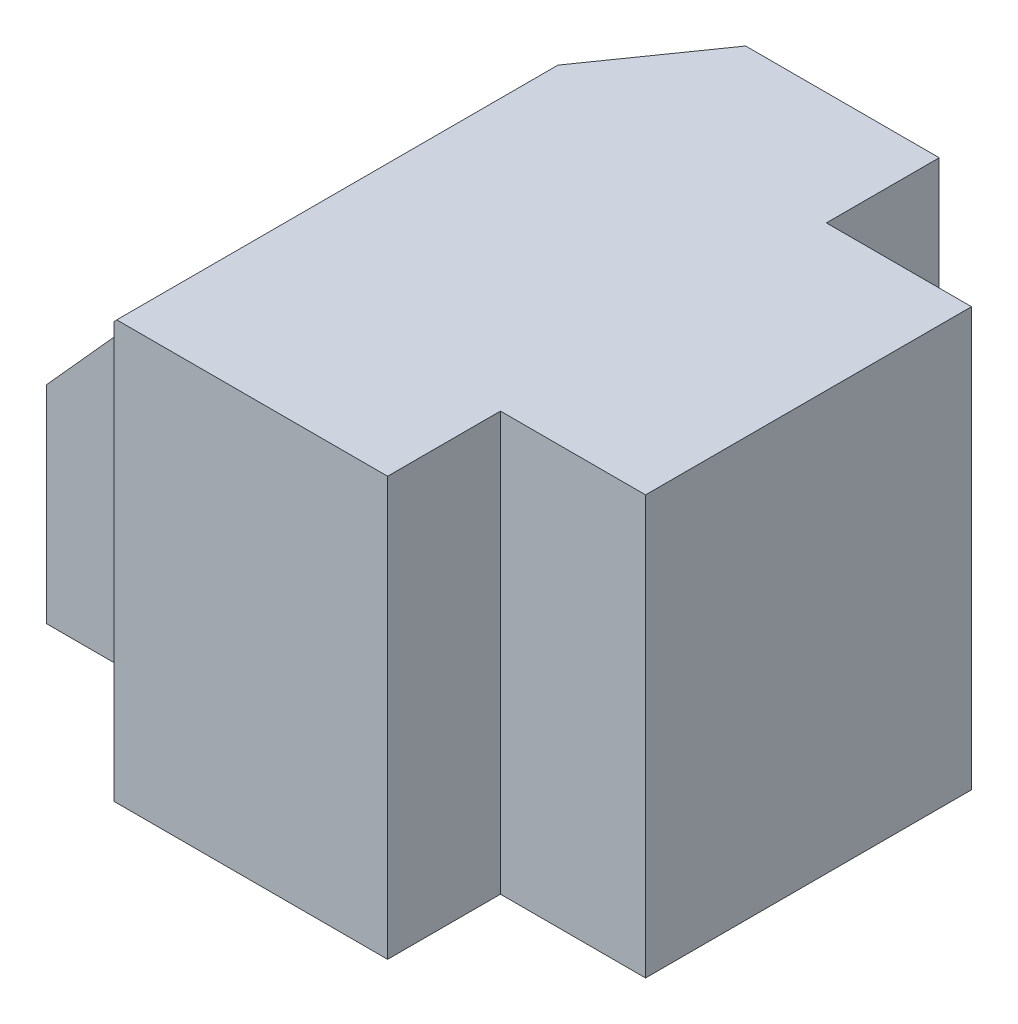
ISO-10303-21;
HEADER;
FILE_DESCRIPTION(('STEP AP214'),'2;1');
FILE_NAME('part.step','',(''),(''),'','','');
FILE_SCHEMA(('AUTOMOTIVE_DESIGN { 1 0 10303 214 1 1 1 1 }'));
ENDSEC;
DATA;
#1=APPLICATION_CONTEXT('core data for automotive mechanical design processes');
#2=APPLICATION_PROTOCOL_DEFINITION('international standard','automotive_design',2000,#1);
#3=PRODUCT_CONTEXT('',#1,'mechanical');
#4=PRODUCT('Part','Part','',(#3));
#5=PRODUCT_RELATED_PRODUCT_CATEGORY('part','',(#4));
#6=PRODUCT_DEFINITION_FORMATION('','',#4);
#7=PRODUCT_DEFINITION_CONTEXT('part definition',#1,'design');
#8=PRODUCT_DEFINITION('design','',#6,#7);
#9=PRODUCT_DEFINITION_SHAPE('','',#8);
#10=(LENGTH_UNIT() NAMED_UNIT(*) SI_UNIT(.MILLI.,.METRE.));
#11=(NAMED_UNIT(*) PLANE_ANGLE_UNIT() SI_UNIT($,.RADIAN.));
#12=(NAMED_UNIT(*) SI_UNIT($,.STERADIAN.) SOLID_ANGLE_UNIT());
#13=UNCERTAINTY_MEASURE_WITH_UNIT(LENGTH_MEASURE(1.E-05),#10,'distance_accuracy_value','');
#14=(GEOMETRIC_REPRESENTATION_CONTEXT(3) GLOBAL_UNCERTAINTY_ASSIGNED_CONTEXT((#13)) GLOBAL_UNIT_ASSIGNED_CONTEXT((#10,
#11,#12)) REPRESENTATION_CONTEXT('',''));
#15=CARTESIAN_POINT('',(0.,0.,0.));
#16=DIRECTION('',(0.,0.,1.));
#17=DIRECTION('',(1.,0.,0.));
#18=AXIS2_PLACEMENT_3D('',#15,#16,#17);
#19=CARTESIAN_POINT('',(117.676562318776,144.78,0.));
#20=DIRECTION('',(1.,0.,0.));
#21=DIRECTION('',(0.,0.,-1.));
#22=AXIS2_PLACEMENT_3D('',#19,#20,#21);
#23=PLANE('',#22);
#24=DIRECTION('',(0.,0.,1.));
#25=VECTOR('',#24,1.);
#26=CARTESIAN_POINT('',(117.676562318776,0.,0.));
#27=LINE('',#26,#25);
#28=CARTESIAN_POINT('',(117.676562318776,0.,-56.3956056739304));
#29=VERTEX_POINT('',#28);
#30=CARTESIAN_POINT('',(117.676562318776,0.,56.3956056739304));
#31=VERTEX_POINT('',#30);
#32=EDGE_CURVE('E146',#29,#31,#27,.T.);
#33=ORIENTED_EDGE('',*,*,#32,.F.);
#34=DIRECTION('',(0.,-1.,0.));
#35=VECTOR('',#34,1.);
#36=CARTESIAN_POINT('',(117.676562318776,144.78,-56.3956056739304));
#37=LINE('',#36,#35);
#38=CARTESIAN_POINT('',(117.676562318776,144.78,-56.3956056739304));
#39=VERTEX_POINT('',#38);
#40=EDGE_CURVE('E142',#39,#29,#37,.T.);
#41=ORIENTED_EDGE('',*,*,#40,.F.);
#42=DIRECTION('',(0.,0.,1.));
#43=VECTOR('',#42,1.);
#44=CARTESIAN_POINT('',(117.676562318776,144.78,0.));
#45=LINE('',#44,#43);
#46=CARTESIAN_POINT('',(117.676562318776,144.78,56.3956056739304));
#47=VERTEX_POINT('',#46);
#48=EDGE_CURVE('E144',#39,#47,#45,.T.);
#49=ORIENTED_EDGE('',*,*,#48,.T.);
#50=DIRECTION('',(0.,-1.,0.));
#51=VECTOR('',#50,1.);
#52=CARTESIAN_POINT('',(117.676562318776,144.78,56.3956056739304));
#53=LINE('',#52,#51);
#54=EDGE_CURVE('E178',#47,#31,#53,.T.);
#55=ORIENTED_EDGE('',*,*,#54,.T.);
#56=EDGE_LOOP('',(#33,#41,#49,#55));
#57=FACE_BOUND('',#56,.T.);
#58=ADVANCED_FACE('F41',(#57),#23,.T.);
#59=CARTESIAN_POINT('',(0.,144.78,-56.3956056739304));
#60=DIRECTION('',(0.,0.,-1.));
#61=DIRECTION('',(-1.,0.,0.));
#62=AXIS2_PLACEMENT_3D('',#59,#60,#61);
#63=PLANE('',#62);
#64=DIRECTION('',(1.,0.,0.));
#65=VECTOR('',#64,1.);
#66=CARTESIAN_POINT('',(0.,0.,-56.3956056739304));
#67=LINE('',#66,#65);
#68=CARTESIAN_POINT('',(67.4595624211315,0.,-56.3956056739304));
#69=VERTEX_POINT('',#68);
#70=EDGE_CURVE('E180',#69,#29,#67,.T.);
#71=ORIENTED_EDGE('',*,*,#70,.F.);
#72=DIRECTION('',(0.,-1.,0.));
#73=VECTOR('',#72,1.);
#74=CARTESIAN_POINT('',(67.4595624211315,144.78,-56.3956056739304));
#75=LINE('',#74,#73);
#76=CARTESIAN_POINT('',(67.4595624211315,144.78,-56.3956056739304));
#77=VERTEX_POINT('',#76);
#78=EDGE_CURVE('E152',#77,#69,#75,.T.);
#79=ORIENTED_EDGE('',*,*,#78,.F.);
#80=DIRECTION('',(1.,0.,0.));
#81=VECTOR('',#80,1.);
#82=CARTESIAN_POINT('',(0.,144.78,-56.3956056739304));
#83=LINE('',#82,#81);
#84=EDGE_CURVE('E157',#77,#39,#83,.T.);
#85=ORIENTED_EDGE('',*,*,#84,.T.);
#86=ORIENTED_EDGE('',*,*,#40,.T.);
#87=EDGE_LOOP('',(#71,#79,#85,#86));
#88=FACE_BOUND('',#87,.T.);
#89=ADVANCED_FACE('F165',(#88),#63,.T.);
#90=CARTESIAN_POINT('',(67.4595624211315,144.78,0.));
#91=DIRECTION('',(1.,0.,0.));
#92=DIRECTION('',(0.,0.,-1.));
#93=AXIS2_PLACEMENT_3D('',#90,#91,#92);
#94=PLANE('',#93);
#95=DIRECTION('',(0.,0.,1.));
#96=VECTOR('',#95,1.);
#97=CARTESIAN_POINT('',(67.4595624211315,0.,0.));
#98=LINE('',#97,#96);
#99=CARTESIAN_POINT('',(67.4595624211315,0.,-95.4405595887344));
#100=VERTEX_POINT('',#99);
#101=EDGE_CURVE('E182',#100,#69,#98,.T.);
#102=ORIENTED_EDGE('',*,*,#101,.F.);
#103=DIRECTION('',(0.,-1.,0.));
#104=VECTOR('',#103,1.);
#105=CARTESIAN_POINT('',(67.4595624211315,144.78,-95.4405595887344));
#106=LINE('',#105,#104);
#107=CARTESIAN_POINT('',(67.4595624211315,144.78,-95.4405595887344));
#108=VERTEX_POINT('',#107);
#109=EDGE_CURVE('E225',#108,#100,#106,.T.);
#110=ORIENTED_EDGE('',*,*,#109,.F.);
#111=DIRECTION('',(0.,0.,1.));
#112=VECTOR('',#111,1.);
#113=CARTESIAN_POINT('',(67.4595624211315,144.78,0.));
#114=LINE('',#113,#112);
#115=EDGE_CURVE('E166',#108,#77,#114,.T.);
#116=ORIENTED_EDGE('',*,*,#115,.T.);
#117=ORIENTED_EDGE('',*,*,#78,.T.);
#118=EDGE_LOOP('',(#102,#110,#116,#117));
#119=FACE_BOUND('',#118,.T.);
#120=ADVANCED_FACE('F296',(#119),#94,.T.);
#121=CARTESIAN_POINT('',(0.,144.78,-95.4405595887344));
#122=DIRECTION('',(0.,0.,-1.));
#123=DIRECTION('',(-1.,0.,0.));
#124=AXIS2_PLACEMENT_3D('',#121,#122,#123);
#125=PLANE('',#124);
#126=DIRECTION('',(1.,0.,0.));
#127=VECTOR('',#126,1.);
#128=CARTESIAN_POINT('',(0.,0.,-95.4405595887344));
#129=LINE('',#128,#127);
#130=CARTESIAN_POINT('',(0.484303416627169,0.,-95.4405595887344));
#131=VERTEX_POINT('',#130);
#132=EDGE_CURVE('E185',#131,#100,#129,.T.);
#133=ORIENTED_EDGE('',*,*,#132,.F.);
#134=DIRECTION('',(0.,1.,0.));
#135=VECTOR('',#134,1.);
#136=CARTESIAN_POINT('',(0.484303416627169,143.642941163211,-95.4405595887344));
#137=LINE('',#136,#135);
#138=CARTESIAN_POINT('',(0.484303416627169,144.78,-95.4405595887344));
#139=VERTEX_POINT('',#138);
#140=EDGE_CURVE('E64',#131,#139,#137,.T.);
#141=ORIENTED_EDGE('',*,*,#140,.T.);
#142=DIRECTION('',(1.,0.,0.));
#143=VECTOR('',#142,1.);
#144=CARTESIAN_POINT('',(0.,144.78,-95.4405595887344));
#145=LINE('',#144,#143);
#146=EDGE_CURVE('E168',#139,#108,#145,.T.);
#147=ORIENTED_EDGE('',*,*,#146,.T.);
#148=ORIENTED_EDGE('',*,*,#109,.T.);
#149=EDGE_LOOP('',(#133,#141,#147,#148));
#150=FACE_BOUND('',#149,.T.);
#151=ADVANCED_FACE('F254',(#150),#125,.T.);
#152=CARTESIAN_POINT('',(-27.2956965833729,144.78,0.));
#153=DIRECTION('',(1.,0.,0.));
#154=DIRECTION('',(0.,0.,-1.));
#155=AXIS2_PLACEMENT_3D('',#152,#153,#154);
#156=PLANE('',#155);
#157=DIRECTION('',(0.,0.,1.));
#158=VECTOR('',#157,1.);
#159=CARTESIAN_POINT('',(-27.2956965833729,143.642941163211,0.));
#160=LINE('',#159,#158);
#161=CARTESIAN_POINT('',(-27.2956965833729,143.642941163211,-53.8672654690619));
#162=VERTEX_POINT('',#161);
#163=CARTESIAN_POINT('',(-27.2956965833729,143.642941163211,-55.7666079614385));
#164=VERTEX_POINT('',#163);
#165=EDGE_CURVE('E233',#162,#164,#160,.F.);
#166=ORIENTED_EDGE('',*,*,#165,.T.);
#167=DIRECTION('',(0.,-1.,0.));
#168=VECTOR('',#167,1.);
#169=CARTESIAN_POINT('',(-27.2956965833729,0.,-55.7666079614385));
#170=LINE('',#169,#168);
#171=CARTESIAN_POINT('',(-27.2956965833729,0.,-55.7666079614385));
#172=VERTEX_POINT('',#171);
#173=EDGE_CURVE('E244',#164,#172,#170,.T.);
#174=ORIENTED_EDGE('',*,*,#173,.T.);
#175=DIRECTION('',(0.,0.,1.));
#176=VECTOR('',#175,1.);
#177=CARTESIAN_POINT('',(-27.2956965833729,0.,0.));
#178=LINE('',#177,#176);
#179=CARTESIAN_POINT('',(-27.2956965833729,0.,-53.8672654690619));
#180=VERTEX_POINT('',#179);
#181=EDGE_CURVE('E187',#172,#180,#178,.T.);
#182=ORIENTED_EDGE('',*,*,#181,.T.);
#183=DIRECTION('',(0.,-1.,0.));
#184=VECTOR('',#183,1.);
#185=CARTESIAN_POINT('',(-27.2956965833729,144.78,-53.8672654690619));
#186=LINE('',#185,#184);
#187=EDGE_CURVE('E222',#162,#180,#186,.T.);
#188=ORIENTED_EDGE('',*,*,#187,.F.);
#189=EDGE_LOOP('',(#166,#174,#182,#188));
#190=FACE_BOUND('',#189,.T.);
#191=ADVANCED_FACE('F264',(#190),#156,.F.);
#192=CARTESIAN_POINT('',(0.,144.78,-53.8672654690619));
#193=DIRECTION('',(0.,0.,-1.));
#194=DIRECTION('',(-1.,0.,0.));
#195=AXIS2_PLACEMENT_3D('',#192,#193,#194);
#196=PLANE('',#195);
#197=DIRECTION('',(0.,-1.,0.));
#198=VECTOR('',#197,1.);
#199=CARTESIAN_POINT('',(-92.1518842081234,144.78,-53.8672654690619));
#200=LINE('',#199,#198);
#201=CARTESIAN_POINT('',(-92.1518842081234,71.6128475230527,-53.8672654690619));
#202=VERTEX_POINT('',#201);
#203=CARTESIAN_POINT('',(-92.1518842081234,0.,-53.8672654690619));
#204=VERTEX_POINT('',#203);
#205=EDGE_CURVE('E220',#202,#204,#200,.T.);
#206=ORIENTED_EDGE('',*,*,#205,.F.);
#207=DIRECTION('',(-0.669130606358859,-0.743144825477393,0.));
#208=VECTOR('',#207,1.);
#209=CARTESIAN_POINT('',(-14.509021945772,157.843982038779,-53.8672654690619));
#210=LINE('',#209,#208);
#211=EDGE_CURVE('E231',#202,#162,#210,.F.);
#212=ORIENTED_EDGE('',*,*,#211,.T.);
#213=ORIENTED_EDGE('',*,*,#187,.T.);
#214=DIRECTION('',(1.,0.,0.));
#215=VECTOR('',#214,1.);
#216=CARTESIAN_POINT('',(0.,0.,-53.8672654690619));
#217=LINE('',#216,#215);
#218=EDGE_CURVE('E189',#204,#180,#217,.T.);
#219=ORIENTED_EDGE('',*,*,#218,.F.);
#220=EDGE_LOOP('',(#206,#212,#213,#219));
#221=FACE_BOUND('',#220,.T.);
#222=ADVANCED_FACE('F268',(#221),#196,.T.);
#223=CARTESIAN_POINT('',(-92.1518842081234,144.78,0.));
#224=DIRECTION('',(-1.,0.,0.));
#225=DIRECTION('',(0.,0.,1.));
#226=AXIS2_PLACEMENT_3D('',#223,#224,#225);
#227=PLANE('',#226);
#228=DIRECTION('',(0.,-1.,0.));
#229=VECTOR('',#228,1.);
#230=CARTESIAN_POINT('',(-92.1518842081234,144.78,53.8672654690619));
#231=LINE('',#230,#229);
#232=CARTESIAN_POINT('',(-92.1518842081234,71.6128475230527,53.8672654690619));
#233=VERTEX_POINT('',#232);
#234=CARTESIAN_POINT('',(-92.1518842081234,0.,53.8672654690619));
#235=VERTEX_POINT('',#234);
#236=EDGE_CURVE('E218',#233,#235,#231,.T.);
#237=ORIENTED_EDGE('',*,*,#236,.F.);
#238=DIRECTION('',(0.,0.,-1.));
#239=VECTOR('',#238,1.);
#240=CARTESIAN_POINT('',(-92.1518842081234,71.6128475230527,0.));
#241=LINE('',#240,#239);
#242=EDGE_CURVE('E151',#233,#202,#241,.T.);
#243=ORIENTED_EDGE('',*,*,#242,.T.);
#244=ORIENTED_EDGE('',*,*,#205,.T.);
#245=DIRECTION('',(0.,0.,-1.));
#246=VECTOR('',#245,1.);
#247=CARTESIAN_POINT('',(-92.1518842081234,0.,0.));
#248=LINE('',#247,#246);
#249=EDGE_CURVE('E192',#235,#204,#248,.T.);
#250=ORIENTED_EDGE('',*,*,#249,.F.);
#251=EDGE_LOOP('',(#237,#243,#244,#250));
#252=FACE_BOUND('',#251,.T.);
#253=ADVANCED_FACE('F274',(#252),#227,.T.);
#254=CARTESIAN_POINT('',(0.,144.78,53.8672654690619));
#255=DIRECTION('',(0.,0.,-1.));
#256=DIRECTION('',(-1.,0.,0.));
#257=AXIS2_PLACEMENT_3D('',#254,#255,#256);
#258=PLANE('',#257);
#259=DIRECTION('',(0.,-1.,0.));
#260=VECTOR('',#259,1.);
#261=CARTESIAN_POINT('',(-27.2956965833729,144.78,53.8672654690619));
#262=LINE('',#261,#260);
#263=CARTESIAN_POINT('',(-27.2956965833729,143.642941163211,53.8672654690619));
#264=VERTEX_POINT('',#263);
#265=CARTESIAN_POINT('',(-27.2956965833729,0.,53.8672654690619));
#266=VERTEX_POINT('',#265);
#267=EDGE_CURVE('E216',#264,#266,#262,.T.);
#268=ORIENTED_EDGE('',*,*,#267,.F.);
#269=DIRECTION('',(0.669130606358859,0.743144825477393,0.));
#270=VECTOR('',#269,1.);
#271=CARTESIAN_POINT('',(-92.1518842081234,71.6128475230527,53.8672654690619));
#272=LINE('',#271,#270);
#273=EDGE_CURVE('E242',#264,#233,#272,.F.);
#274=ORIENTED_EDGE('',*,*,#273,.T.);
#275=ORIENTED_EDGE('',*,*,#236,.T.);
#276=DIRECTION('',(1.,0.,0.));
#277=VECTOR('',#276,1.);
#278=CARTESIAN_POINT('',(0.,0.,53.8672654690619));
#279=LINE('',#278,#277);
#280=EDGE_CURVE('E195',#235,#266,#279,.T.);
#281=ORIENTED_EDGE('',*,*,#280,.T.);
#282=EDGE_LOOP('',(#268,#274,#275,#281));
#283=FACE_BOUND('',#282,.T.);
#284=ADVANCED_FACE('F280',(#283),#258,.F.);
#285=CARTESIAN_POINT('',(-27.2956965833729,144.78,0.));
#286=DIRECTION('',(1.,0.,0.));
#287=DIRECTION('',(0.,0.,-1.));
#288=AXIS2_PLACEMENT_3D('',#285,#286,#287);
#289=PLANE('',#288);
#290=DIRECTION('',(0.,-1.,0.));
#291=VECTOR('',#290,1.);
#292=CARTESIAN_POINT('',(-27.2956965833729,144.78,95.4405595887344));
#293=LINE('',#292,#291);
#294=CARTESIAN_POINT('',(-27.2956965833729,143.642941163211,95.4405595887344));
#295=VERTEX_POINT('',#294);
#296=CARTESIAN_POINT('',(-27.2956965833729,0.,95.4405595887344));
#297=VERTEX_POINT('',#296);
#298=EDGE_CURVE('E214',#295,#297,#293,.T.);
#299=ORIENTED_EDGE('',*,*,#298,.F.);
#300=DIRECTION('',(0.,0.,1.));
#301=VECTOR('',#300,1.);
#302=CARTESIAN_POINT('',(-27.2956965833729,143.642941163211,0.));
#303=LINE('',#302,#301);
#304=EDGE_CURVE('E240',#295,#264,#303,.F.);
#305=ORIENTED_EDGE('',*,*,#304,.T.);
#306=ORIENTED_EDGE('',*,*,#267,.T.);
#307=DIRECTION('',(0.,0.,1.));
#308=VECTOR('',#307,1.);
#309=CARTESIAN_POINT('',(-27.2956965833729,0.,0.));
#310=LINE('',#309,#308);
#311=EDGE_CURVE('E198',#266,#297,#310,.T.);
#312=ORIENTED_EDGE('',*,*,#311,.T.);
#313=EDGE_LOOP('',(#299,#305,#306,#312));
#314=FACE_BOUND('',#313,.T.);
#315=ADVANCED_FACE('F283',(#314),#289,.F.);
#316=CARTESIAN_POINT('',(0.,144.78,95.4405595887344));
#317=DIRECTION('',(0.,0.,-1.));
#318=DIRECTION('',(-1.,0.,0.));
#319=AXIS2_PLACEMENT_3D('',#316,#317,#318);
#320=PLANE('',#319);
#321=DIRECTION('',(1.,0.,0.));
#322=VECTOR('',#321,1.);
#323=CARTESIAN_POINT('',(0.,144.78,95.4405595887344));
#324=LINE('',#323,#322);
#325=CARTESIAN_POINT('',(-26.2718842081232,144.78,95.4405595887344));
#326=VERTEX_POINT('',#325);
#327=CARTESIAN_POINT('',(67.4595624211315,144.78,95.4405595887344));
#328=VERTEX_POINT('',#327);
#329=EDGE_CURVE('E172',#326,#328,#324,.T.);
#330=ORIENTED_EDGE('',*,*,#329,.F.);
#331=DIRECTION('',(0.669130606358859,0.743144825477393,0.));
#332=VECTOR('',#331,1.);
#333=CARTESIAN_POINT('',(-92.1518842081234,71.6128475230527,95.4405595887344));
#334=LINE('',#333,#332);
#335=EDGE_CURVE('E238',#326,#295,#334,.F.);
#336=ORIENTED_EDGE('',*,*,#335,.T.);
#337=ORIENTED_EDGE('',*,*,#298,.T.);
#338=DIRECTION('',(1.,0.,0.));
#339=VECTOR('',#338,1.);
#340=CARTESIAN_POINT('',(0.,0.,95.4405595887344));
#341=LINE('',#340,#339);
#342=CARTESIAN_POINT('',(67.4595624211315,0.,95.4405595887344));
#343=VERTEX_POINT('',#342);
#344=EDGE_CURVE('E201',#297,#343,#341,.T.);
#345=ORIENTED_EDGE('',*,*,#344,.T.);
#346=DIRECTION('',(0.,-1.,0.));
#347=VECTOR('',#346,1.);
#348=CARTESIAN_POINT('',(67.4595624211315,144.78,95.4405595887344));
#349=LINE('',#348,#347);
#350=EDGE_CURVE('E212',#328,#343,#349,.T.);
#351=ORIENTED_EDGE('',*,*,#350,.F.);
#352=EDGE_LOOP('',(#330,#336,#337,#345,#351));
#353=FACE_BOUND('',#352,.T.);
#354=ADVANCED_FACE('F287',(#353),#320,.F.);
#355=CARTESIAN_POINT('',(67.4595624211315,144.78,0.));
#356=DIRECTION('',(1.,0.,0.));
#357=DIRECTION('',(0.,0.,-1.));
#358=AXIS2_PLACEMENT_3D('',#355,#356,#357);
#359=PLANE('',#358);
#360=DIRECTION('',(0.,0.,1.));
#361=VECTOR('',#360,1.);
#362=CARTESIAN_POINT('',(67.4595624211315,0.,0.));
#363=LINE('',#362,#361);
#364=CARTESIAN_POINT('',(67.4595624211315,0.,56.3956056739304));
#365=VERTEX_POINT('',#364);
#366=EDGE_CURVE('E204',#365,#343,#363,.T.);
#367=ORIENTED_EDGE('',*,*,#366,.F.);
#368=DIRECTION('',(0.,-1.,0.));
#369=VECTOR('',#368,1.);
#370=CARTESIAN_POINT('',(67.4595624211315,144.78,56.3956056739304));
#371=LINE('',#370,#369);
#372=CARTESIAN_POINT('',(67.4595624211315,144.78,56.3956056739304));
#373=VERTEX_POINT('',#372);
#374=EDGE_CURVE('E210',#373,#365,#371,.T.);
#375=ORIENTED_EDGE('',*,*,#374,.F.);
#376=DIRECTION('',(0.,0.,1.));
#377=VECTOR('',#376,1.);
#378=CARTESIAN_POINT('',(67.4595624211315,144.78,0.));
#379=LINE('',#378,#377);
#380=EDGE_CURVE('E174',#373,#328,#379,.T.);
#381=ORIENTED_EDGE('',*,*,#380,.T.);
#382=ORIENTED_EDGE('',*,*,#350,.T.);
#383=EDGE_LOOP('',(#367,#375,#381,#382));
#384=FACE_BOUND('',#383,.T.);
#385=ADVANCED_FACE('F291',(#384),#359,.T.);
#386=CARTESIAN_POINT('',(0.,144.78,56.3956056739304));
#387=DIRECTION('',(0.,0.,-1.));
#388=DIRECTION('',(-1.,0.,0.));
#389=AXIS2_PLACEMENT_3D('',#386,#387,#388);
#390=PLANE('',#389);
#391=DIRECTION('',(1.,0.,0.));
#392=VECTOR('',#391,1.);
#393=CARTESIAN_POINT('',(0.,0.,56.3956056739304));
#394=LINE('',#393,#392);
#395=EDGE_CURVE('E163',#365,#31,#394,.T.);
#396=ORIENTED_EDGE('',*,*,#395,.T.);
#397=ORIENTED_EDGE('',*,*,#54,.F.);
#398=DIRECTION('',(1.,0.,0.));
#399=VECTOR('',#398,1.);
#400=CARTESIAN_POINT('',(0.,144.78,56.3956056739304));
#401=LINE('',#400,#399);
#402=EDGE_CURVE('E161',#373,#47,#401,.T.);
#403=ORIENTED_EDGE('',*,*,#402,.F.);
#404=ORIENTED_EDGE('',*,*,#374,.T.);
#405=EDGE_LOOP('',(#396,#397,#403,#404));
#406=FACE_BOUND('',#405,.T.);
#407=ADVANCED_FACE('F294',(#406),#390,.F.);
#408=CARTESIAN_POINT('',(0.,144.78,0.));
#409=DIRECTION('',(0.,1.,0.));
#410=DIRECTION('',(0.,0.,1.));
#411=AXIS2_PLACEMENT_3D('',#408,#409,#410);
#412=PLANE('',#411);
#413=ORIENTED_EDGE('',*,*,#146,.F.);
#414=DIRECTION('',(-0.573576436351047,0.,0.819152044288991));
#415=VECTOR('',#414,1.);
#416=CARTESIAN_POINT('',(-44.5174223143082,144.78,-31.1714346861439));
#417=LINE('',#416,#415);
#418=CARTESIAN_POINT('',(-26.2718842081232,144.78,-57.2287635644293));
#419=VERTEX_POINT('',#418);
#420=EDGE_CURVE('E50',#139,#419,#417,.T.);
#421=ORIENTED_EDGE('',*,*,#420,.T.);
#422=DIRECTION('',(0.,0.,1.));
#423=VECTOR('',#422,1.);
#424=CARTESIAN_POINT('',(-26.2718842081232,144.78,0.));
#425=LINE('',#424,#423);
#426=EDGE_CURVE('E236',#419,#326,#425,.T.);
#427=ORIENTED_EDGE('',*,*,#426,.T.);
#428=ORIENTED_EDGE('',*,*,#329,.T.);
#429=ORIENTED_EDGE('',*,*,#380,.F.);
#430=ORIENTED_EDGE('',*,*,#402,.T.);
#431=ORIENTED_EDGE('',*,*,#48,.F.);
#432=ORIENTED_EDGE('',*,*,#84,.F.);
#433=ORIENTED_EDGE('',*,*,#115,.F.);
#434=EDGE_LOOP('',(#413,#421,#427,#428,#429,#430,#431,#432,#433));
#435=FACE_BOUND('',#434,.T.);
#436=ADVANCED_FACE('F155',(#435),#412,.T.);
#437=CARTESIAN_POINT('',(0.,0.,0.));
#438=DIRECTION('',(0.,1.,0.));
#439=DIRECTION('',(0.,0.,1.));
#440=AXIS2_PLACEMENT_3D('',#437,#438,#439);
#441=PLANE('',#440);
#442=ORIENTED_EDGE('',*,*,#181,.F.);
#443=DIRECTION('',(0.573576436351047,0.,-0.819152044288991));
#444=VECTOR('',#443,1.);
#445=CARTESIAN_POINT('',(-27.2956965833729,0.,-55.7666079614385));
#446=LINE('',#445,#444);
#447=EDGE_CURVE('E247',#172,#131,#446,.T.);
#448=ORIENTED_EDGE('',*,*,#447,.T.);
#449=ORIENTED_EDGE('',*,*,#132,.T.);
#450=ORIENTED_EDGE('',*,*,#101,.T.);
#451=ORIENTED_EDGE('',*,*,#70,.T.);
#452=ORIENTED_EDGE('',*,*,#32,.T.);
#453=ORIENTED_EDGE('',*,*,#395,.F.);
#454=ORIENTED_EDGE('',*,*,#366,.T.);
#455=ORIENTED_EDGE('',*,*,#344,.F.);
#456=ORIENTED_EDGE('',*,*,#311,.F.);
#457=ORIENTED_EDGE('',*,*,#280,.F.);
#458=ORIENTED_EDGE('',*,*,#249,.T.);
#459=ORIENTED_EDGE('',*,*,#218,.T.);
#460=EDGE_LOOP('',(#442,#448,#449,#450,#451,#452,#453,#454,#455,#456,#457,#458,#459));
#461=FACE_BOUND('',#460,.T.);
#462=ADVANCED_FACE('F251',(#461),#441,.F.);
#463=CARTESIAN_POINT('',(-92.1518842081234,71.6128475230527,0.));
#464=DIRECTION('',(0.743144825477393,-0.669130606358859,0.));
#465=DIRECTION('',(0.,0.,-1.));
#466=AXIS2_PLACEMENT_3D('',#463,#464,#465);
#467=PLANE('',#466);
#468=ORIENTED_EDGE('',*,*,#426,.F.);
#469=DIRECTION('',(0.483760221569342,0.537270156251453,-0.690881196175377));
#470=VECTOR('',#469,1.);
#471=CARTESIAN_POINT('',(-79.8332970918575,85.2940245393912,19.2648614837671));
#472=LINE('',#471,#470);
#473=EDGE_CURVE('E11',#419,#164,#472,.F.);
#474=ORIENTED_EDGE('',*,*,#473,.T.);
#475=ORIENTED_EDGE('',*,*,#165,.F.);
#476=ORIENTED_EDGE('',*,*,#211,.F.);
#477=ORIENTED_EDGE('',*,*,#242,.F.);
#478=ORIENTED_EDGE('',*,*,#273,.F.);
#479=ORIENTED_EDGE('',*,*,#304,.F.);
#480=ORIENTED_EDGE('',*,*,#335,.F.);
#481=EDGE_LOOP('',(#468,#474,#475,#476,#477,#478,#479,#480));
#482=FACE_BOUND('',#481,.T.);
#483=ADVANCED_FACE('F260',(#482),#467,.F.);
#484=CARTESIAN_POINT('',(-27.2956965833729,144.78,-55.7666079614385));
#485=DIRECTION('',(-0.819152044288991,0.,-0.573576436351047));
#486=DIRECTION('',(0.,1.,0.));
#487=AXIS2_PLACEMENT_3D('',#484,#485,#486);
#488=PLANE('',#487);
#489=ORIENTED_EDGE('',*,*,#420,.F.);
#490=ORIENTED_EDGE('',*,*,#140,.F.);
#491=ORIENTED_EDGE('',*,*,#447,.F.);
#492=ORIENTED_EDGE('',*,*,#173,.F.);
#493=ORIENTED_EDGE('',*,*,#473,.F.);
#494=EDGE_LOOP('',(#489,#490,#491,#492,#493));
#495=FACE_BOUND('',#494,.T.);
#496=ADVANCED_FACE('F44',(#495),#488,.T.);
#497=CLOSED_SHELL('',(#58,#89,#120,#151,#191,#222,#253,#284,#315,#354,#385,#407,#436,#462,#483,#496));
#498=MANIFOLD_SOLID_BREP('B2',#497);
#499=ADVANCED_BREP_SHAPE_REPRESENTATION('',(#18,#498),#14);
#500=SHAPE_DEFINITION_REPRESENTATION(#9,#499);
ENDSEC;
END-ISO-10303-21;
